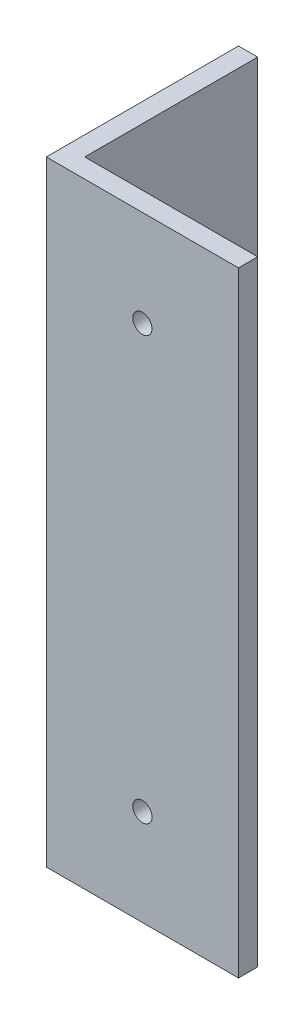
ISO-10303-21;
HEADER;
FILE_DESCRIPTION(('STEP AP214'),'2;1');
FILE_NAME('part.step','',(''),(''),'','','');
FILE_SCHEMA(('AUTOMOTIVE_DESIGN { 1 0 10303 214 1 1 1 1 }'));
ENDSEC;
DATA;
#1=APPLICATION_CONTEXT('core data for automotive mechanical design processes');
#2=APPLICATION_PROTOCOL_DEFINITION('international standard','automotive_design',2000,#1);
#3=PRODUCT_CONTEXT('',#1,'mechanical');
#4=PRODUCT('Part','Part','',(#3));
#5=PRODUCT_RELATED_PRODUCT_CATEGORY('part','',(#4));
#6=PRODUCT_DEFINITION_FORMATION('','',#4);
#7=PRODUCT_DEFINITION_CONTEXT('part definition',#1,'design');
#8=PRODUCT_DEFINITION('design','',#6,#7);
#9=PRODUCT_DEFINITION_SHAPE('','',#8);
#10=(LENGTH_UNIT() NAMED_UNIT(*) SI_UNIT(.MILLI.,.METRE.));
#11=(NAMED_UNIT(*) PLANE_ANGLE_UNIT() SI_UNIT($,.RADIAN.));
#12=(NAMED_UNIT(*) SI_UNIT($,.STERADIAN.) SOLID_ANGLE_UNIT());
#13=UNCERTAINTY_MEASURE_WITH_UNIT(LENGTH_MEASURE(1.E-05),#10,'distance_accuracy_value','');
#14=(GEOMETRIC_REPRESENTATION_CONTEXT(3) GLOBAL_UNCERTAINTY_ASSIGNED_CONTEXT((#13)) GLOBAL_UNIT_ASSIGNED_CONTEXT((#10,
#11,#12)) REPRESENTATION_CONTEXT('',''));
#15=CARTESIAN_POINT('',(0.,0.,0.));
#16=DIRECTION('',(0.,0.,1.));
#17=DIRECTION('',(1.,0.,0.));
#18=AXIS2_PLACEMENT_3D('',#15,#16,#17);
#19=CARTESIAN_POINT('',(50.,80.,0.));
#20=DIRECTION('',(0.,0.,-1.));
#21=DIRECTION('',(-1.,0.,0.));
#22=AXIS2_PLACEMENT_3D('',#19,#20,#21);
#23=PLANE('',#22);
#24=CARTESIAN_POINT('',(25.,55.,0.));
#25=DIRECTION('',(0.,0.,1.));
#26=DIRECTION('',(1.,0.,0.));
#27=AXIS2_PLACEMENT_3D('',#24,#25,#26);
#28=CIRCLE('',#27,2.5);
#29=CARTESIAN_POINT('',(27.5,55.,0.));
#30=VERTEX_POINT('',#29);
#31=EDGE_CURVE('E136',#30,#30,#28,.T.);
#32=ORIENTED_EDGE('',*,*,#31,.F.);
#33=EDGE_LOOP('',(#32));
#34=FACE_BOUND('',#33,.T.);
#35=CARTESIAN_POINT('',(25.,-55.,0.));
#36=DIRECTION('',(0.,0.,1.));
#37=DIRECTION('',(-1.,0.,0.));
#38=AXIS2_PLACEMENT_3D('',#35,#36,#37);
#39=CIRCLE('',#38,2.5);
#40=CARTESIAN_POINT('',(22.5,-55.,0.));
#41=VERTEX_POINT('',#40);
#42=EDGE_CURVE('E141',#41,#41,#39,.T.);
#43=ORIENTED_EDGE('',*,*,#42,.F.);
#44=EDGE_LOOP('',(#43));
#45=FACE_BOUND('',#44,.T.);
#46=DIRECTION('',(1.,0.,0.));
#47=VECTOR('',#46,1.);
#48=CARTESIAN_POINT('',(50.,-80.,0.));
#49=LINE('',#48,#47);
#50=CARTESIAN_POINT('',(0.,-80.,0.));
#51=VERTEX_POINT('',#50);
#52=CARTESIAN_POINT('',(50.,-80.,0.));
#53=VERTEX_POINT('',#52);
#54=EDGE_CURVE('E119',#51,#53,#49,.T.);
#55=ORIENTED_EDGE('',*,*,#54,.T.);
#56=DIRECTION('',(0.,-1.,0.));
#57=VECTOR('',#56,1.);
#58=CARTESIAN_POINT('',(50.,80.,0.));
#59=LINE('',#58,#57);
#60=CARTESIAN_POINT('',(50.,80.,0.));
#61=VERTEX_POINT('',#60);
#62=EDGE_CURVE('E11',#61,#53,#59,.T.);
#63=ORIENTED_EDGE('',*,*,#62,.F.);
#64=DIRECTION('',(1.,0.,0.));
#65=VECTOR('',#64,1.);
#66=CARTESIAN_POINT('',(50.,80.,0.));
#67=LINE('',#66,#65);
#68=CARTESIAN_POINT('',(0.,80.,0.));
#69=VERTEX_POINT('',#68);
#70=EDGE_CURVE('E129',#69,#61,#67,.T.);
#71=ORIENTED_EDGE('',*,*,#70,.F.);
#72=DIRECTION('',(0.,-1.,0.));
#73=VECTOR('',#72,1.);
#74=CARTESIAN_POINT('',(0.,80.,0.));
#75=LINE('',#74,#73);
#76=EDGE_CURVE('E115',#69,#51,#75,.T.);
#77=ORIENTED_EDGE('',*,*,#76,.T.);
#78=EDGE_LOOP('',(#55,#63,#71,#77));
#79=FACE_BOUND('',#78,.T.);
#80=ADVANCED_FACE('F33',(#34,#45,#79),#23,.F.);
#81=CARTESIAN_POINT('',(50.,80.,-5.));
#82=DIRECTION('',(-1.,0.,0.));
#83=DIRECTION('',(0.,0.,1.));
#84=AXIS2_PLACEMENT_3D('',#81,#82,#83);
#85=PLANE('',#84);
#86=DIRECTION('',(0.,0.,-1.));
#87=VECTOR('',#86,1.);
#88=CARTESIAN_POINT('',(50.,-80.,-5.));
#89=LINE('',#88,#87);
#90=CARTESIAN_POINT('',(50.,-80.,-5.));
#91=VERTEX_POINT('',#90);
#92=EDGE_CURVE('E122',#53,#91,#89,.T.);
#93=ORIENTED_EDGE('',*,*,#92,.T.);
#94=DIRECTION('',(0.,-1.,0.));
#95=VECTOR('',#94,1.);
#96=CARTESIAN_POINT('',(50.,80.,-5.));
#97=LINE('',#96,#95);
#98=CARTESIAN_POINT('',(50.,80.,-5.));
#99=VERTEX_POINT('',#98);
#100=EDGE_CURVE('E42',#99,#91,#97,.T.);
#101=ORIENTED_EDGE('',*,*,#100,.F.);
#102=DIRECTION('',(0.,0.,-1.));
#103=VECTOR('',#102,1.);
#104=CARTESIAN_POINT('',(50.,80.,-5.));
#105=LINE('',#104,#103);
#106=EDGE_CURVE('E88',#61,#99,#105,.T.);
#107=ORIENTED_EDGE('',*,*,#106,.F.);
#108=ORIENTED_EDGE('',*,*,#62,.T.);
#109=EDGE_LOOP('',(#93,#101,#107,#108));
#110=FACE_BOUND('',#109,.T.);
#111=ADVANCED_FACE('F154',(#110),#85,.F.);
#112=CARTESIAN_POINT('',(5.,80.,-5.));
#113=DIRECTION('',(0.,0.,1.));
#114=DIRECTION('',(1.,0.,0.));
#115=AXIS2_PLACEMENT_3D('',#112,#113,#114);
#116=PLANE('',#115);
#117=CARTESIAN_POINT('',(25.,55.,-5.));
#118=DIRECTION('',(0.,0.,1.));
#119=DIRECTION('',(1.,0.,0.));
#120=AXIS2_PLACEMENT_3D('',#117,#118,#119);
#121=CIRCLE('',#120,2.5);
#122=CARTESIAN_POINT('',(27.5,55.,-5.));
#123=VERTEX_POINT('',#122);
#124=EDGE_CURVE('E36',#123,#123,#121,.T.);
#125=ORIENTED_EDGE('',*,*,#124,.T.);
#126=EDGE_LOOP('',(#125));
#127=FACE_BOUND('',#126,.T.);
#128=CARTESIAN_POINT('',(25.,-55.,-5.));
#129=DIRECTION('',(0.,0.,1.));
#130=DIRECTION('',(1.,0.,0.));
#131=AXIS2_PLACEMENT_3D('',#128,#129,#130);
#132=CIRCLE('',#131,2.5);
#133=CARTESIAN_POINT('',(27.5,-55.,-5.));
#134=VERTEX_POINT('',#133);
#135=EDGE_CURVE('E134',#134,#134,#132,.T.);
#136=ORIENTED_EDGE('',*,*,#135,.T.);
#137=EDGE_LOOP('',(#136));
#138=FACE_BOUND('',#137,.T.);
#139=DIRECTION('',(-1.,0.,0.));
#140=VECTOR('',#139,1.);
#141=CARTESIAN_POINT('',(5.,-80.,-5.));
#142=LINE('',#141,#140);
#143=CARTESIAN_POINT('',(5.,-80.,-5.));
#144=VERTEX_POINT('',#143);
#145=EDGE_CURVE('E124',#91,#144,#142,.T.);
#146=ORIENTED_EDGE('',*,*,#145,.T.);
#147=DIRECTION('',(0.,-1.,0.));
#148=VECTOR('',#147,1.);
#149=CARTESIAN_POINT('',(5.,80.,-5.));
#150=LINE('',#149,#148);
#151=CARTESIAN_POINT('',(5.,80.,-5.));
#152=VERTEX_POINT('',#151);
#153=EDGE_CURVE('E110',#152,#144,#150,.T.);
#154=ORIENTED_EDGE('',*,*,#153,.F.);
#155=DIRECTION('',(-1.,0.,0.));
#156=VECTOR('',#155,1.);
#157=CARTESIAN_POINT('',(5.,80.,-5.));
#158=LINE('',#157,#156);
#159=EDGE_CURVE('E101',#99,#152,#158,.T.);
#160=ORIENTED_EDGE('',*,*,#159,.F.);
#161=ORIENTED_EDGE('',*,*,#100,.T.);
#162=EDGE_LOOP('',(#146,#154,#160,#161));
#163=FACE_BOUND('',#162,.T.);
#164=ADVANCED_FACE('F157',(#127,#138,#163),#116,.F.);
#165=CARTESIAN_POINT('',(5.,80.,-50.));
#166=DIRECTION('',(-1.,0.,0.));
#167=DIRECTION('',(0.,0.,1.));
#168=AXIS2_PLACEMENT_3D('',#165,#166,#167);
#169=PLANE('',#168);
#170=CARTESIAN_POINT('',(5.,55.,-25.));
#171=DIRECTION('',(-1.,0.,0.));
#172=DIRECTION('',(0.,0.,1.));
#173=AXIS2_PLACEMENT_3D('',#170,#171,#172);
#174=CIRCLE('',#173,2.5);
#175=CARTESIAN_POINT('',(5.,55.,-22.5));
#176=VERTEX_POINT('',#175);
#177=EDGE_CURVE('E146',#176,#176,#174,.T.);
#178=ORIENTED_EDGE('',*,*,#177,.T.);
#179=EDGE_LOOP('',(#178));
#180=FACE_BOUND('',#179,.T.);
#181=CARTESIAN_POINT('',(5.,-55.,-25.));
#182=DIRECTION('',(-1.,0.,0.));
#183=DIRECTION('',(0.,0.,1.));
#184=AXIS2_PLACEMENT_3D('',#181,#182,#183);
#185=CIRCLE('',#184,2.5);
#186=CARTESIAN_POINT('',(5.,-55.,-22.5));
#187=VERTEX_POINT('',#186);
#188=EDGE_CURVE('E213',#187,#187,#185,.T.);
#189=ORIENTED_EDGE('',*,*,#188,.T.);
#190=EDGE_LOOP('',(#189));
#191=FACE_BOUND('',#190,.T.);
#192=DIRECTION('',(0.,0.,-1.));
#193=VECTOR('',#192,1.);
#194=CARTESIAN_POINT('',(5.,-80.,-50.));
#195=LINE('',#194,#193);
#196=CARTESIAN_POINT('',(5.,-80.,-50.));
#197=VERTEX_POINT('',#196);
#198=EDGE_CURVE('E109',#144,#197,#195,.T.);
#199=ORIENTED_EDGE('',*,*,#198,.T.);
#200=DIRECTION('',(0.,-1.,0.));
#201=VECTOR('',#200,1.);
#202=CARTESIAN_POINT('',(5.,80.,-50.));
#203=LINE('',#202,#201);
#204=CARTESIAN_POINT('',(5.,80.,-50.));
#205=VERTEX_POINT('',#204);
#206=EDGE_CURVE('E106',#205,#197,#203,.T.);
#207=ORIENTED_EDGE('',*,*,#206,.F.);
#208=DIRECTION('',(0.,0.,-1.));
#209=VECTOR('',#208,1.);
#210=CARTESIAN_POINT('',(5.,80.,-50.));
#211=LINE('',#210,#209);
#212=EDGE_CURVE('E95',#152,#205,#211,.T.);
#213=ORIENTED_EDGE('',*,*,#212,.F.);
#214=ORIENTED_EDGE('',*,*,#153,.T.);
#215=EDGE_LOOP('',(#199,#207,#213,#214));
#216=FACE_BOUND('',#215,.T.);
#217=ADVANCED_FACE('F107',(#180,#191,#216),#169,.F.);
#218=CARTESIAN_POINT('',(0.,80.,-50.));
#219=DIRECTION('',(0.,0.,1.));
#220=DIRECTION('',(1.,0.,0.));
#221=AXIS2_PLACEMENT_3D('',#218,#219,#220);
#222=PLANE('',#221);
#223=DIRECTION('',(-1.,0.,0.));
#224=VECTOR('',#223,1.);
#225=CARTESIAN_POINT('',(0.,-80.,-50.));
#226=LINE('',#225,#224);
#227=CARTESIAN_POINT('',(0.,-80.,-50.));
#228=VERTEX_POINT('',#227);
#229=EDGE_CURVE('E74',#197,#228,#226,.T.);
#230=ORIENTED_EDGE('',*,*,#229,.T.);
#231=DIRECTION('',(0.,-1.,0.));
#232=VECTOR('',#231,1.);
#233=CARTESIAN_POINT('',(0.,80.,-50.));
#234=LINE('',#233,#232);
#235=CARTESIAN_POINT('',(0.,80.,-50.));
#236=VERTEX_POINT('',#235);
#237=EDGE_CURVE('E111',#236,#228,#234,.T.);
#238=ORIENTED_EDGE('',*,*,#237,.F.);
#239=DIRECTION('',(-1.,0.,0.));
#240=VECTOR('',#239,1.);
#241=CARTESIAN_POINT('',(0.,80.,-50.));
#242=LINE('',#241,#240);
#243=EDGE_CURVE('E99',#205,#236,#242,.T.);
#244=ORIENTED_EDGE('',*,*,#243,.F.);
#245=ORIENTED_EDGE('',*,*,#206,.T.);
#246=EDGE_LOOP('',(#230,#238,#244,#245));
#247=FACE_BOUND('',#246,.T.);
#248=ADVANCED_FACE('F113',(#247),#222,.F.);
#249=CARTESIAN_POINT('',(0.,80.,0.));
#250=DIRECTION('',(1.,0.,0.));
#251=DIRECTION('',(0.,0.,-1.));
#252=AXIS2_PLACEMENT_3D('',#249,#250,#251);
#253=PLANE('',#252);
#254=CARTESIAN_POINT('',(0.,55.,-25.));
#255=DIRECTION('',(-1.,0.,0.));
#256=DIRECTION('',(0.,0.,1.));
#257=AXIS2_PLACEMENT_3D('',#254,#255,#256);
#258=CIRCLE('',#257,2.5);
#259=CARTESIAN_POINT('',(0.,55.,-22.5));
#260=VERTEX_POINT('',#259);
#261=EDGE_CURVE('E209',#260,#260,#258,.T.);
#262=ORIENTED_EDGE('',*,*,#261,.F.);
#263=EDGE_LOOP('',(#262));
#264=FACE_BOUND('',#263,.T.);
#265=CARTESIAN_POINT('',(0.,-55.,-25.));
#266=DIRECTION('',(-1.,0.,0.));
#267=DIRECTION('',(0.,0.,-1.));
#268=AXIS2_PLACEMENT_3D('',#265,#266,#267);
#269=CIRCLE('',#268,2.5);
#270=CARTESIAN_POINT('',(0.,-55.,-27.5));
#271=VERTEX_POINT('',#270);
#272=EDGE_CURVE('E217',#271,#271,#269,.T.);
#273=ORIENTED_EDGE('',*,*,#272,.F.);
#274=EDGE_LOOP('',(#273));
#275=FACE_BOUND('',#274,.T.);
#276=DIRECTION('',(0.,0.,1.));
#277=VECTOR('',#276,1.);
#278=CARTESIAN_POINT('',(0.,-80.,0.));
#279=LINE('',#278,#277);
#280=EDGE_CURVE('E80',#228,#51,#279,.T.);
#281=ORIENTED_EDGE('',*,*,#280,.T.);
#282=ORIENTED_EDGE('',*,*,#76,.F.);
#283=DIRECTION('',(0.,0.,1.));
#284=VECTOR('',#283,1.);
#285=CARTESIAN_POINT('',(0.,80.,0.));
#286=LINE('',#285,#284);
#287=EDGE_CURVE('E51',#236,#69,#286,.T.);
#288=ORIENTED_EDGE('',*,*,#287,.F.);
#289=ORIENTED_EDGE('',*,*,#237,.T.);
#290=EDGE_LOOP('',(#281,#282,#288,#289));
#291=FACE_BOUND('',#290,.T.);
#292=ADVANCED_FACE('F162',(#264,#275,#291),#253,.F.);
#293=CARTESIAN_POINT('',(0.,80.,0.));
#294=DIRECTION('',(0.,-1.,0.));
#295=DIRECTION('',(0.,0.,-1.));
#296=AXIS2_PLACEMENT_3D('',#293,#294,#295);
#297=PLANE('',#296);
#298=ORIENTED_EDGE('',*,*,#70,.T.);
#299=ORIENTED_EDGE('',*,*,#106,.T.);
#300=ORIENTED_EDGE('',*,*,#159,.T.);
#301=ORIENTED_EDGE('',*,*,#212,.T.);
#302=ORIENTED_EDGE('',*,*,#243,.T.);
#303=ORIENTED_EDGE('',*,*,#287,.T.);
#304=EDGE_LOOP('',(#298,#299,#300,#301,#302,#303));
#305=FACE_BOUND('',#304,.T.);
#306=ADVANCED_FACE('F97',(#305),#297,.F.);
#307=CARTESIAN_POINT('',(0.,-80.,0.));
#308=DIRECTION('',(0.,-1.,0.));
#309=DIRECTION('',(0.,0.,-1.));
#310=AXIS2_PLACEMENT_3D('',#307,#308,#309);
#311=PLANE('',#310);
#312=ORIENTED_EDGE('',*,*,#54,.F.);
#313=ORIENTED_EDGE('',*,*,#280,.F.);
#314=ORIENTED_EDGE('',*,*,#229,.F.);
#315=ORIENTED_EDGE('',*,*,#198,.F.);
#316=ORIENTED_EDGE('',*,*,#145,.F.);
#317=ORIENTED_EDGE('',*,*,#92,.F.);
#318=EDGE_LOOP('',(#312,#313,#314,#315,#316,#317));
#319=FACE_BOUND('',#318,.T.);
#320=ADVANCED_FACE('F160',(#319),#311,.T.);
#321=CARTESIAN_POINT('',(25.,-55.,-50.));
#322=DIRECTION('',(0.,0.,1.));
#323=DIRECTION('',(1.,0.,0.));
#324=AXIS2_PLACEMENT_3D('',#321,#322,#323);
#325=CYLINDRICAL_SURFACE('',#324,2.5);
#326=ORIENTED_EDGE('',*,*,#42,.T.);
#327=EDGE_LOOP('',(#326));
#328=FACE_BOUND('',#327,.T.);
#329=ORIENTED_EDGE('',*,*,#135,.F.);
#330=EDGE_LOOP('',(#329));
#331=FACE_BOUND('',#330,.T.);
#332=ADVANCED_FACE('F187',(#328,#331),#325,.F.);
#333=CARTESIAN_POINT('',(25.,55.,-50.));
#334=DIRECTION('',(0.,0.,1.));
#335=DIRECTION('',(1.,0.,0.));
#336=AXIS2_PLACEMENT_3D('',#333,#334,#335);
#337=CYLINDRICAL_SURFACE('',#336,2.5);
#338=ORIENTED_EDGE('',*,*,#31,.T.);
#339=EDGE_LOOP('',(#338));
#340=FACE_BOUND('',#339,.T.);
#341=ORIENTED_EDGE('',*,*,#124,.F.);
#342=EDGE_LOOP('',(#341));
#343=FACE_BOUND('',#342,.T.);
#344=ADVANCED_FACE('F190',(#340,#343),#337,.F.);
#345=CARTESIAN_POINT('',(50.,-55.,-25.));
#346=DIRECTION('',(-1.,0.,0.));
#347=DIRECTION('',(0.,0.,1.));
#348=AXIS2_PLACEMENT_3D('',#345,#346,#347);
#349=CYLINDRICAL_SURFACE('',#348,2.5);
#350=ORIENTED_EDGE('',*,*,#272,.T.);
#351=EDGE_LOOP('',(#350));
#352=FACE_BOUND('',#351,.T.);
#353=ORIENTED_EDGE('',*,*,#188,.F.);
#354=EDGE_LOOP('',(#353));
#355=FACE_BOUND('',#354,.T.);
#356=ADVANCED_FACE('F196',(#352,#355),#349,.F.);
#357=CARTESIAN_POINT('',(50.,55.,-25.));
#358=DIRECTION('',(-1.,0.,0.));
#359=DIRECTION('',(0.,0.,1.));
#360=AXIS2_PLACEMENT_3D('',#357,#358,#359);
#361=CYLINDRICAL_SURFACE('',#360,2.5);
#362=ORIENTED_EDGE('',*,*,#261,.T.);
#363=EDGE_LOOP('',(#362));
#364=FACE_BOUND('',#363,.T.);
#365=ORIENTED_EDGE('',*,*,#177,.F.);
#366=EDGE_LOOP('',(#365));
#367=FACE_BOUND('',#366,.T.);
#368=ADVANCED_FACE('F201',(#364,#367),#361,.F.);
#369=CLOSED_SHELL('',(#80,#111,#164,#217,#248,#292,#306,#320,#332,#344,#356,#368));
#370=MANIFOLD_SOLID_BREP('B2',#369);
#371=ADVANCED_BREP_SHAPE_REPRESENTATION('',(#18,#370),#14);
#372=SHAPE_DEFINITION_REPRESENTATION(#9,#371);
ENDSEC;
END-ISO-10303-21;
